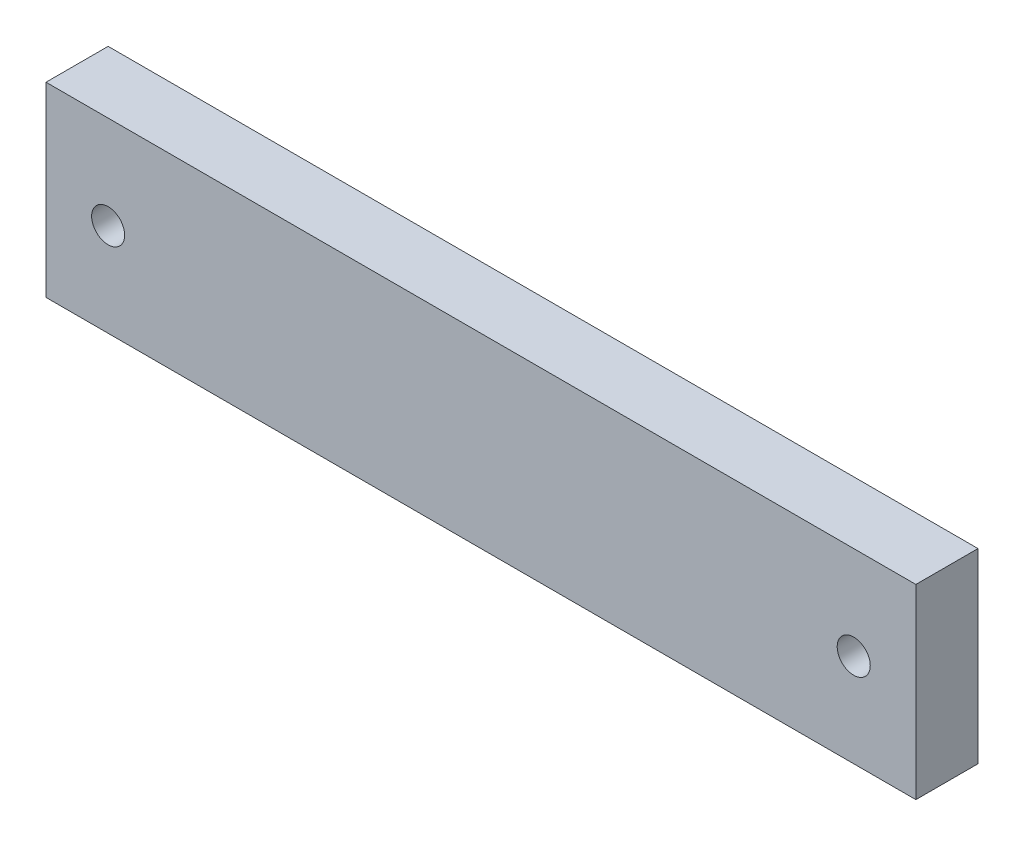
ISO-10303-21;
HEADER;
FILE_DESCRIPTION(('STEP AP214'),'2;1');
FILE_NAME('part.step','',(''),(''),'','','');
FILE_SCHEMA(('AUTOMOTIVE_DESIGN { 1 0 10303 214 1 1 1 1 }'));
ENDSEC;
DATA;
#1=APPLICATION_CONTEXT('core data for automotive mechanical design processes');
#2=APPLICATION_PROTOCOL_DEFINITION('international standard','automotive_design',2000,#1);
#3=PRODUCT_CONTEXT('',#1,'mechanical');
#4=PRODUCT('Part','Part','',(#3));
#5=PRODUCT_RELATED_PRODUCT_CATEGORY('part','',(#4));
#6=PRODUCT_DEFINITION_FORMATION('','',#4);
#7=PRODUCT_DEFINITION_CONTEXT('part definition',#1,'design');
#8=PRODUCT_DEFINITION('design','',#6,#7);
#9=PRODUCT_DEFINITION_SHAPE('','',#8);
#10=(LENGTH_UNIT() NAMED_UNIT(*) SI_UNIT(.MILLI.,.METRE.));
#11=(NAMED_UNIT(*) PLANE_ANGLE_UNIT() SI_UNIT($,.RADIAN.));
#12=(NAMED_UNIT(*) SI_UNIT($,.STERADIAN.) SOLID_ANGLE_UNIT());
#13=UNCERTAINTY_MEASURE_WITH_UNIT(LENGTH_MEASURE(1.E-05),#10,'distance_accuracy_value','');
#14=(GEOMETRIC_REPRESENTATION_CONTEXT(3) GLOBAL_UNCERTAINTY_ASSIGNED_CONTEXT((#13)) GLOBAL_UNIT_ASSIGNED_CONTEXT((#10,
#11,#12)) REPRESENTATION_CONTEXT('',''));
#15=CARTESIAN_POINT('',(0.,0.,0.));
#16=DIRECTION('',(0.,0.,1.));
#17=DIRECTION('',(1.,0.,0.));
#18=AXIS2_PLACEMENT_3D('',#15,#16,#17);
#19=CARTESIAN_POINT('',(0.,0.,12.7));
#20=DIRECTION('',(1.,0.,0.));
#21=DIRECTION('',(0.,0.,-1.));
#22=AXIS2_PLACEMENT_3D('',#19,#20,#21);
#23=PLANE('',#22);
#24=DIRECTION('',(0.,-1.,0.));
#25=VECTOR('',#24,1.);
#26=CARTESIAN_POINT('',(0.,0.,0.));
#27=LINE('',#26,#25);
#28=CARTESIAN_POINT('',(0.,38.1,0.));
#29=VERTEX_POINT('',#28);
#30=CARTESIAN_POINT('',(0.,0.,0.));
#31=VERTEX_POINT('',#30);
#32=EDGE_CURVE('E109',#29,#31,#27,.T.);
#33=ORIENTED_EDGE('',*,*,#32,.T.);
#34=DIRECTION('',(0.,0.,-1.));
#35=VECTOR('',#34,1.);
#36=CARTESIAN_POINT('',(0.,0.,12.7));
#37=LINE('',#36,#35);
#38=CARTESIAN_POINT('',(0.,0.,12.7));
#39=VERTEX_POINT('',#38);
#40=EDGE_CURVE('E11',#39,#31,#37,.T.);
#41=ORIENTED_EDGE('',*,*,#40,.F.);
#42=DIRECTION('',(0.,-1.,0.));
#43=VECTOR('',#42,1.);
#44=CARTESIAN_POINT('',(0.,0.,12.7));
#45=LINE('',#44,#43);
#46=CARTESIAN_POINT('',(0.,38.1,12.7));
#47=VERTEX_POINT('',#46);
#48=EDGE_CURVE('E92',#47,#39,#45,.T.);
#49=ORIENTED_EDGE('',*,*,#48,.F.);
#50=DIRECTION('',(0.,0.,-1.));
#51=VECTOR('',#50,1.);
#52=CARTESIAN_POINT('',(0.,38.1,12.7));
#53=LINE('',#52,#51);
#54=EDGE_CURVE('E105',#47,#29,#53,.T.);
#55=ORIENTED_EDGE('',*,*,#54,.T.);
#56=EDGE_LOOP('',(#33,#41,#49,#55));
#57=FACE_BOUND('',#56,.T.);
#58=ADVANCED_FACE('F40',(#57),#23,.F.);
#59=CARTESIAN_POINT('',(0.,0.,12.7));
#60=DIRECTION('',(0.,1.,0.));
#61=DIRECTION('',(0.,0.,1.));
#62=AXIS2_PLACEMENT_3D('',#59,#60,#61);
#63=PLANE('',#62);
#64=DIRECTION('',(1.,0.,0.));
#65=VECTOR('',#64,1.);
#66=CARTESIAN_POINT('',(0.,0.,0.));
#67=LINE('',#66,#65);
#68=CARTESIAN_POINT('',(177.8,0.,0.));
#69=VERTEX_POINT('',#68);
#70=EDGE_CURVE('E97',#31,#69,#67,.T.);
#71=ORIENTED_EDGE('',*,*,#70,.T.);
#72=DIRECTION('',(0.,0.,-1.));
#73=VECTOR('',#72,1.);
#74=CARTESIAN_POINT('',(177.8,0.,12.7));
#75=LINE('',#74,#73);
#76=CARTESIAN_POINT('',(177.8,0.,12.7));
#77=VERTEX_POINT('',#76);
#78=EDGE_CURVE('E49',#77,#69,#75,.T.);
#79=ORIENTED_EDGE('',*,*,#78,.F.);
#80=DIRECTION('',(1.,0.,0.));
#81=VECTOR('',#80,1.);
#82=CARTESIAN_POINT('',(0.,0.,12.7));
#83=LINE('',#82,#81);
#84=EDGE_CURVE('E87',#39,#77,#83,.T.);
#85=ORIENTED_EDGE('',*,*,#84,.F.);
#86=ORIENTED_EDGE('',*,*,#40,.T.);
#87=EDGE_LOOP('',(#71,#79,#85,#86));
#88=FACE_BOUND('',#87,.T.);
#89=ADVANCED_FACE('F96',(#88),#63,.F.);
#90=CARTESIAN_POINT('',(177.8,0.,12.7));
#91=DIRECTION('',(-1.,0.,0.));
#92=DIRECTION('',(0.,0.,1.));
#93=AXIS2_PLACEMENT_3D('',#90,#91,#92);
#94=PLANE('',#93);
#95=DIRECTION('',(0.,1.,0.));
#96=VECTOR('',#95,1.);
#97=CARTESIAN_POINT('',(177.8,0.,0.));
#98=LINE('',#97,#96);
#99=CARTESIAN_POINT('',(177.8,38.1,0.));
#100=VERTEX_POINT('',#99);
#101=EDGE_CURVE('E74',#69,#100,#98,.T.);
#102=ORIENTED_EDGE('',*,*,#101,.T.);
#103=DIRECTION('',(0.,0.,-1.));
#104=VECTOR('',#103,1.);
#105=CARTESIAN_POINT('',(177.8,38.1,12.7));
#106=LINE('',#105,#104);
#107=CARTESIAN_POINT('',(177.8,38.1,12.7));
#108=VERTEX_POINT('',#107);
#109=EDGE_CURVE('E99',#108,#100,#106,.T.);
#110=ORIENTED_EDGE('',*,*,#109,.F.);
#111=DIRECTION('',(0.,1.,0.));
#112=VECTOR('',#111,1.);
#113=CARTESIAN_POINT('',(177.8,0.,12.7));
#114=LINE('',#113,#112);
#115=EDGE_CURVE('E90',#77,#108,#114,.T.);
#116=ORIENTED_EDGE('',*,*,#115,.F.);
#117=ORIENTED_EDGE('',*,*,#78,.T.);
#118=EDGE_LOOP('',(#102,#110,#116,#117));
#119=FACE_BOUND('',#118,.T.);
#120=ADVANCED_FACE('F100',(#119),#94,.F.);
#121=CARTESIAN_POINT('',(0.,38.1,12.7));
#122=DIRECTION('',(0.,-1.,0.));
#123=DIRECTION('',(0.,0.,-1.));
#124=AXIS2_PLACEMENT_3D('',#121,#122,#123);
#125=PLANE('',#124);
#126=DIRECTION('',(-1.,0.,0.));
#127=VECTOR('',#126,1.);
#128=CARTESIAN_POINT('',(0.,38.1,0.));
#129=LINE('',#128,#127);
#130=EDGE_CURVE('E80',#100,#29,#129,.T.);
#131=ORIENTED_EDGE('',*,*,#130,.T.);
#132=ORIENTED_EDGE('',*,*,#54,.F.);
#133=DIRECTION('',(-1.,0.,0.));
#134=VECTOR('',#133,1.);
#135=CARTESIAN_POINT('',(0.,38.1,12.7));
#136=LINE('',#135,#134);
#137=EDGE_CURVE('E57',#108,#47,#136,.T.);
#138=ORIENTED_EDGE('',*,*,#137,.F.);
#139=ORIENTED_EDGE('',*,*,#109,.T.);
#140=EDGE_LOOP('',(#131,#132,#138,#139));
#141=FACE_BOUND('',#140,.T.);
#142=ADVANCED_FACE('F124',(#141),#125,.F.);
#143=CARTESIAN_POINT('',(0.,0.,12.7));
#144=DIRECTION('',(0.,0.,-1.));
#145=DIRECTION('',(-1.,0.,0.));
#146=AXIS2_PLACEMENT_3D('',#143,#144,#145);
#147=PLANE('',#146);
#148=CARTESIAN_POINT('',(12.7,19.05,12.7));
#149=DIRECTION('',(0.,0.,1.));
#150=DIRECTION('',(1.,0.,0.));
#151=AXIS2_PLACEMENT_3D('',#148,#149,#150);
#152=CIRCLE('',#151,3.37819999999999);
#153=CARTESIAN_POINT('',(16.0782,19.05,12.7));
#154=VERTEX_POINT('',#153);
#155=EDGE_CURVE('E143',#154,#154,#152,.T.);
#156=ORIENTED_EDGE('',*,*,#155,.F.);
#157=EDGE_LOOP('',(#156));
#158=FACE_BOUND('',#157,.T.);
#159=CARTESIAN_POINT('',(165.1,19.05,12.7));
#160=DIRECTION('',(0.,0.,1.));
#161=DIRECTION('',(1.,0.,0.));
#162=AXIS2_PLACEMENT_3D('',#159,#160,#161);
#163=CIRCLE('',#162,3.3782);
#164=CARTESIAN_POINT('',(168.4782,19.05,12.7));
#165=VERTEX_POINT('',#164);
#166=EDGE_CURVE('E135',#165,#165,#163,.T.);
#167=ORIENTED_EDGE('',*,*,#166,.F.);
#168=EDGE_LOOP('',(#167));
#169=FACE_BOUND('',#168,.T.);
#170=ORIENTED_EDGE('',*,*,#48,.T.);
#171=ORIENTED_EDGE('',*,*,#84,.T.);
#172=ORIENTED_EDGE('',*,*,#115,.T.);
#173=ORIENTED_EDGE('',*,*,#137,.T.);
#174=EDGE_LOOP('',(#170,#171,#172,#173));
#175=FACE_BOUND('',#174,.T.);
#176=ADVANCED_FACE('F88',(#158,#169,#175),#147,.F.);
#177=CARTESIAN_POINT('',(0.,0.,0.));
#178=DIRECTION('',(0.,0.,-1.));
#179=DIRECTION('',(-1.,0.,0.));
#180=AXIS2_PLACEMENT_3D('',#177,#178,#179);
#181=PLANE('',#180);
#182=CARTESIAN_POINT('',(12.7,19.05,0.));
#183=DIRECTION('',(0.,0.,1.));
#184=DIRECTION('',(1.,0.,0.));
#185=AXIS2_PLACEMENT_3D('',#182,#183,#184);
#186=CIRCLE('',#185,3.3782);
#187=CARTESIAN_POINT('',(16.0782,19.05,0.));
#188=VERTEX_POINT('',#187);
#189=EDGE_CURVE('E139',#188,#188,#186,.T.);
#190=ORIENTED_EDGE('',*,*,#189,.T.);
#191=EDGE_LOOP('',(#190));
#192=FACE_BOUND('',#191,.T.);
#193=CARTESIAN_POINT('',(165.1,19.05,0.));
#194=DIRECTION('',(0.,0.,1.));
#195=DIRECTION('',(1.,0.,0.));
#196=AXIS2_PLACEMENT_3D('',#193,#194,#195);
#197=CIRCLE('',#196,3.3782);
#198=CARTESIAN_POINT('',(168.4782,19.05,0.));
#199=VERTEX_POINT('',#198);
#200=EDGE_CURVE('E113',#199,#199,#197,.T.);
#201=ORIENTED_EDGE('',*,*,#200,.T.);
#202=EDGE_LOOP('',(#201));
#203=FACE_BOUND('',#202,.T.);
#204=ORIENTED_EDGE('',*,*,#32,.F.);
#205=ORIENTED_EDGE('',*,*,#130,.F.);
#206=ORIENTED_EDGE('',*,*,#101,.F.);
#207=ORIENTED_EDGE('',*,*,#70,.F.);
#208=EDGE_LOOP('',(#204,#205,#206,#207));
#209=FACE_BOUND('',#208,.T.);
#210=ADVANCED_FACE('F127',(#192,#203,#209),#181,.T.);
#211=CARTESIAN_POINT('',(165.1,19.05,12.7));
#212=DIRECTION('',(0.,0.,1.));
#213=DIRECTION('',(1.,0.,0.));
#214=AXIS2_PLACEMENT_3D('',#211,#212,#213);
#215=CYLINDRICAL_SURFACE('',#214,3.3782);
#216=ORIENTED_EDGE('',*,*,#200,.F.);
#217=EDGE_LOOP('',(#216));
#218=FACE_BOUND('',#217,.T.);
#219=ORIENTED_EDGE('',*,*,#166,.T.);
#220=EDGE_LOOP('',(#219));
#221=FACE_BOUND('',#220,.T.);
#222=ADVANCED_FACE('F156',(#218,#221),#215,.F.);
#223=CARTESIAN_POINT('',(12.7,19.05,12.7));
#224=DIRECTION('',(0.,0.,1.));
#225=DIRECTION('',(1.,0.,0.));
#226=AXIS2_PLACEMENT_3D('',#223,#224,#225);
#227=CYLINDRICAL_SURFACE('',#226,3.37819999999999);
#228=ORIENTED_EDGE('',*,*,#189,.F.);
#229=EDGE_LOOP('',(#228));
#230=FACE_BOUND('',#229,.T.);
#231=ORIENTED_EDGE('',*,*,#155,.T.);
#232=EDGE_LOOP('',(#231));
#233=FACE_BOUND('',#232,.T.);
#234=ADVANCED_FACE('F149',(#230,#233),#227,.F.);
#235=CLOSED_SHELL('',(#58,#89,#120,#142,#176,#210,#222,#234));
#236=MANIFOLD_SOLID_BREP('B2',#235);
#237=ADVANCED_BREP_SHAPE_REPRESENTATION('',(#18,#236),#14);
#238=SHAPE_DEFINITION_REPRESENTATION(#9,#237);
ENDSEC;
END-ISO-10303-21;
